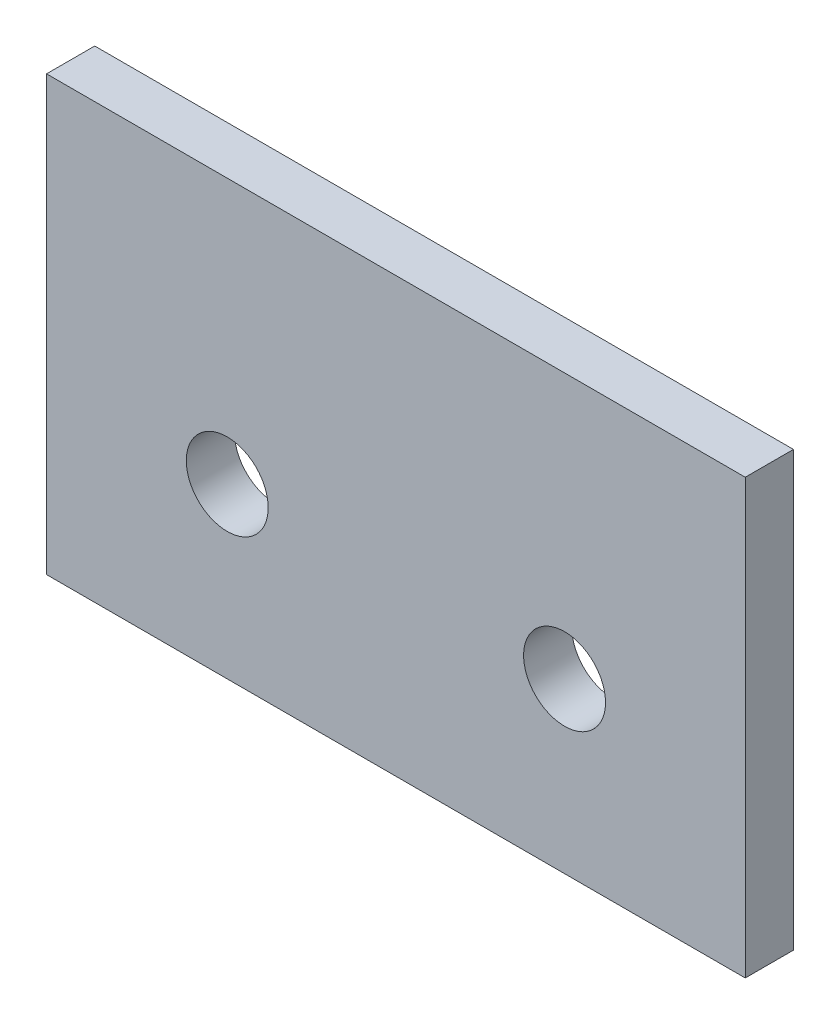
ISO-10303-21;
HEADER;
FILE_DESCRIPTION(('STEP AP214'),'2;1');
FILE_NAME('part.step','',(''),(''),'','','');
FILE_SCHEMA(('AUTOMOTIVE_DESIGN { 1 0 10303 214 1 1 1 1 }'));
ENDSEC;
DATA;
#1=APPLICATION_CONTEXT('core data for automotive mechanical design processes');
#2=APPLICATION_PROTOCOL_DEFINITION('international standard','automotive_design',2000,#1);
#3=PRODUCT_CONTEXT('',#1,'mechanical');
#4=PRODUCT('Part','Part','',(#3));
#5=PRODUCT_RELATED_PRODUCT_CATEGORY('part','',(#4));
#6=PRODUCT_DEFINITION_FORMATION('','',#4);
#7=PRODUCT_DEFINITION_CONTEXT('part definition',#1,'design');
#8=PRODUCT_DEFINITION('design','',#6,#7);
#9=PRODUCT_DEFINITION_SHAPE('','',#8);
#10=(LENGTH_UNIT() NAMED_UNIT(*) SI_UNIT(.MILLI.,.METRE.));
#11=(NAMED_UNIT(*) PLANE_ANGLE_UNIT() SI_UNIT($,.RADIAN.));
#12=(NAMED_UNIT(*) SI_UNIT($,.STERADIAN.) SOLID_ANGLE_UNIT());
#13=UNCERTAINTY_MEASURE_WITH_UNIT(LENGTH_MEASURE(1.E-05),#10,'distance_accuracy_value','');
#14=(GEOMETRIC_REPRESENTATION_CONTEXT(3) GLOBAL_UNCERTAINTY_ASSIGNED_CONTEXT((#13)) GLOBAL_UNIT_ASSIGNED_CONTEXT((#10,
#11,#12)) REPRESENTATION_CONTEXT('',''));
#15=CARTESIAN_POINT('',(0.,0.,0.));
#16=DIRECTION('',(0.,0.,1.));
#17=DIRECTION('',(1.,0.,0.));
#18=AXIS2_PLACEMENT_3D('',#15,#16,#17);
#19=CARTESIAN_POINT('',(0.,0.,2.));
#20=DIRECTION('',(0.,0.,-1.));
#21=DIRECTION('',(-1.,0.,0.));
#22=AXIS2_PLACEMENT_3D('',#19,#20,#21);
#23=PLANE('',#22);
#24=DIRECTION('',(0.,-1.,0.));
#25=VECTOR('',#24,1.);
#26=CARTESIAN_POINT('',(0.,0.,2.));
#27=LINE('',#26,#25);
#28=CARTESIAN_POINT('',(0.,18.,2.));
#29=VERTEX_POINT('',#28);
#30=CARTESIAN_POINT('',(0.,0.,2.));
#31=VERTEX_POINT('',#30);
#32=EDGE_CURVE('E96',#29,#31,#27,.T.);
#33=ORIENTED_EDGE('',*,*,#32,.T.);
#34=DIRECTION('',(1.,0.,0.));
#35=VECTOR('',#34,1.);
#36=CARTESIAN_POINT('',(0.,0.,2.));
#37=LINE('',#36,#35);
#38=CARTESIAN_POINT('',(29.,0.,2.));
#39=VERTEX_POINT('',#38);
#40=EDGE_CURVE('E91',#31,#39,#37,.T.);
#41=ORIENTED_EDGE('',*,*,#40,.T.);
#42=DIRECTION('',(0.,1.,0.));
#43=VECTOR('',#42,1.);
#44=CARTESIAN_POINT('',(29.,0.,2.));
#45=LINE('',#44,#43);
#46=CARTESIAN_POINT('',(29.,18.,2.));
#47=VERTEX_POINT('',#46);
#48=EDGE_CURVE('E94',#39,#47,#45,.T.);
#49=ORIENTED_EDGE('',*,*,#48,.T.);
#50=DIRECTION('',(-1.,0.,0.));
#51=VECTOR('',#50,1.);
#52=CARTESIAN_POINT('',(0.,18.,2.));
#53=LINE('',#52,#51);
#54=EDGE_CURVE('E61',#47,#29,#53,.T.);
#55=ORIENTED_EDGE('',*,*,#54,.T.);
#56=EDGE_LOOP('',(#33,#41,#49,#55));
#57=FACE_BOUND('',#56,.T.);
#58=CARTESIAN_POINT('',(21.5,7.,2.));
#59=DIRECTION('',(0.,0.,1.));
#60=DIRECTION('',(1.,0.,0.));
#61=AXIS2_PLACEMENT_3D('',#58,#59,#60);
#62=CIRCLE('',#61,1.7);
#63=CARTESIAN_POINT('',(23.2,7.,2.));
#64=VERTEX_POINT('',#63);
#65=EDGE_CURVE('E116',#64,#64,#62,.T.);
#66=ORIENTED_EDGE('',*,*,#65,.F.);
#67=EDGE_LOOP('',(#66));
#68=FACE_BOUND('',#67,.T.);
#69=CARTESIAN_POINT('',(7.49999999999997,7.,2.));
#70=DIRECTION('',(0.,0.,1.));
#71=DIRECTION('',(-1.,0.,0.));
#72=AXIS2_PLACEMENT_3D('',#69,#70,#71);
#73=CIRCLE('',#72,1.7);
#74=CARTESIAN_POINT('',(5.79999999999997,7.,2.));
#75=VERTEX_POINT('',#74);
#76=EDGE_CURVE('E138',#75,#75,#73,.T.);
#77=ORIENTED_EDGE('',*,*,#76,.F.);
#78=EDGE_LOOP('',(#77));
#79=FACE_BOUND('',#78,.T.);
#80=ADVANCED_FACE('F43',(#57,#68,#79),#23,.F.);
#81=CARTESIAN_POINT('',(0.,0.,0.));
#82=DIRECTION('',(0.,0.,-1.));
#83=DIRECTION('',(-1.,0.,0.));
#84=AXIS2_PLACEMENT_3D('',#81,#82,#83);
#85=PLANE('',#84);
#86=CARTESIAN_POINT('',(21.5,7.,0.));
#87=DIRECTION('',(0.,0.,1.));
#88=DIRECTION('',(1.,0.,0.));
#89=AXIS2_PLACEMENT_3D('',#86,#87,#88);
#90=CIRCLE('',#89,1.7);
#91=CARTESIAN_POINT('',(23.2,7.,0.));
#92=VERTEX_POINT('',#91);
#93=EDGE_CURVE('E134',#92,#92,#90,.T.);
#94=ORIENTED_EDGE('',*,*,#93,.T.);
#95=EDGE_LOOP('',(#94));
#96=FACE_BOUND('',#95,.T.);
#97=DIRECTION('',(0.,-1.,0.));
#98=VECTOR('',#97,1.);
#99=CARTESIAN_POINT('',(0.,0.,0.));
#100=LINE('',#99,#98);
#101=CARTESIAN_POINT('',(0.,18.,0.));
#102=VERTEX_POINT('',#101);
#103=CARTESIAN_POINT('',(0.,0.,0.));
#104=VERTEX_POINT('',#103);
#105=EDGE_CURVE('E112',#102,#104,#100,.T.);
#106=ORIENTED_EDGE('',*,*,#105,.F.);
#107=DIRECTION('',(-1.,0.,0.));
#108=VECTOR('',#107,1.);
#109=CARTESIAN_POINT('',(0.,18.,0.));
#110=LINE('',#109,#108);
#111=CARTESIAN_POINT('',(29.,18.,0.));
#112=VERTEX_POINT('',#111);
#113=EDGE_CURVE('E84',#112,#102,#110,.T.);
#114=ORIENTED_EDGE('',*,*,#113,.F.);
#115=DIRECTION('',(0.,1.,0.));
#116=VECTOR('',#115,1.);
#117=CARTESIAN_POINT('',(29.,0.,0.));
#118=LINE('',#117,#116);
#119=CARTESIAN_POINT('',(29.,0.,0.));
#120=VERTEX_POINT('',#119);
#121=EDGE_CURVE('E78',#120,#112,#118,.T.);
#122=ORIENTED_EDGE('',*,*,#121,.F.);
#123=DIRECTION('',(1.,0.,0.));
#124=VECTOR('',#123,1.);
#125=CARTESIAN_POINT('',(0.,0.,0.));
#126=LINE('',#125,#124);
#127=EDGE_CURVE('E101',#104,#120,#126,.T.);
#128=ORIENTED_EDGE('',*,*,#127,.F.);
#129=EDGE_LOOP('',(#106,#114,#122,#128));
#130=FACE_BOUND('',#129,.T.);
#131=CARTESIAN_POINT('',(7.49999999999997,7.,0.));
#132=DIRECTION('',(0.,0.,1.));
#133=DIRECTION('',(-1.,0.,0.));
#134=AXIS2_PLACEMENT_3D('',#131,#132,#133);
#135=CIRCLE('',#134,1.7);
#136=CARTESIAN_POINT('',(5.79999999999997,7.,0.));
#137=VERTEX_POINT('',#136);
#138=EDGE_CURVE('E142',#137,#137,#135,.T.);
#139=ORIENTED_EDGE('',*,*,#138,.T.);
#140=EDGE_LOOP('',(#139));
#141=FACE_BOUND('',#140,.T.);
#142=ADVANCED_FACE('F129',(#96,#130,#141),#85,.T.);
#143=CARTESIAN_POINT('',(0.,0.,2.));
#144=DIRECTION('',(1.,0.,0.));
#145=DIRECTION('',(0.,0.,-1.));
#146=AXIS2_PLACEMENT_3D('',#143,#144,#145);
#147=PLANE('',#146);
#148=ORIENTED_EDGE('',*,*,#105,.T.);
#149=DIRECTION('',(0.,0.,-1.));
#150=VECTOR('',#149,1.);
#151=CARTESIAN_POINT('',(0.,0.,2.));
#152=LINE('',#151,#150);
#153=EDGE_CURVE('E11',#31,#104,#152,.T.);
#154=ORIENTED_EDGE('',*,*,#153,.F.);
#155=ORIENTED_EDGE('',*,*,#32,.F.);
#156=DIRECTION('',(0.,0.,-1.));
#157=VECTOR('',#156,1.);
#158=CARTESIAN_POINT('',(0.,18.,2.));
#159=LINE('',#158,#157);
#160=EDGE_CURVE('E108',#29,#102,#159,.T.);
#161=ORIENTED_EDGE('',*,*,#160,.T.);
#162=EDGE_LOOP('',(#148,#154,#155,#161));
#163=FACE_BOUND('',#162,.T.);
#164=ADVANCED_FACE('F45',(#163),#147,.F.);
#165=CARTESIAN_POINT('',(0.,0.,2.));
#166=DIRECTION('',(0.,1.,0.));
#167=DIRECTION('',(0.,0.,1.));
#168=AXIS2_PLACEMENT_3D('',#165,#166,#167);
#169=PLANE('',#168);
#170=ORIENTED_EDGE('',*,*,#127,.T.);
#171=DIRECTION('',(0.,0.,-1.));
#172=VECTOR('',#171,1.);
#173=CARTESIAN_POINT('',(29.,0.,2.));
#174=LINE('',#173,#172);
#175=EDGE_CURVE('E53',#39,#120,#174,.T.);
#176=ORIENTED_EDGE('',*,*,#175,.F.);
#177=ORIENTED_EDGE('',*,*,#40,.F.);
#178=ORIENTED_EDGE('',*,*,#153,.T.);
#179=EDGE_LOOP('',(#170,#176,#177,#178));
#180=FACE_BOUND('',#179,.T.);
#181=ADVANCED_FACE('F100',(#180),#169,.F.);
#182=CARTESIAN_POINT('',(29.,0.,2.));
#183=DIRECTION('',(-1.,0.,0.));
#184=DIRECTION('',(0.,0.,1.));
#185=AXIS2_PLACEMENT_3D('',#182,#183,#184);
#186=PLANE('',#185);
#187=ORIENTED_EDGE('',*,*,#121,.T.);
#188=DIRECTION('',(0.,0.,-1.));
#189=VECTOR('',#188,1.);
#190=CARTESIAN_POINT('',(29.,18.,2.));
#191=LINE('',#190,#189);
#192=EDGE_CURVE('E103',#47,#112,#191,.T.);
#193=ORIENTED_EDGE('',*,*,#192,.F.);
#194=ORIENTED_EDGE('',*,*,#48,.F.);
#195=ORIENTED_EDGE('',*,*,#175,.T.);
#196=EDGE_LOOP('',(#187,#193,#194,#195));
#197=FACE_BOUND('',#196,.T.);
#198=ADVANCED_FACE('F104',(#197),#186,.F.);
#199=CARTESIAN_POINT('',(0.,18.,2.));
#200=DIRECTION('',(0.,-1.,0.));
#201=DIRECTION('',(1.,0.,0.));
#202=AXIS2_PLACEMENT_3D('',#199,#200,#201);
#203=PLANE('',#202);
#204=ORIENTED_EDGE('',*,*,#113,.T.);
#205=ORIENTED_EDGE('',*,*,#160,.F.);
#206=ORIENTED_EDGE('',*,*,#54,.F.);
#207=ORIENTED_EDGE('',*,*,#192,.T.);
#208=EDGE_LOOP('',(#204,#205,#206,#207));
#209=FACE_BOUND('',#208,.T.);
#210=ADVANCED_FACE('F126',(#209),#203,.F.);
#211=CARTESIAN_POINT('',(21.5,7.,2.));
#212=DIRECTION('',(0.,0.,-1.));
#213=DIRECTION('',(-1.,0.,0.));
#214=AXIS2_PLACEMENT_3D('',#211,#212,#213);
#215=CYLINDRICAL_SURFACE('',#214,1.7);
#216=ORIENTED_EDGE('',*,*,#65,.T.);
#217=EDGE_LOOP('',(#216));
#218=FACE_BOUND('',#217,.T.);
#219=ORIENTED_EDGE('',*,*,#93,.F.);
#220=EDGE_LOOP('',(#219));
#221=FACE_BOUND('',#220,.T.);
#222=ADVANCED_FACE('F161',(#218,#221),#215,.F.);
#223=CARTESIAN_POINT('',(7.49999999999997,7.,2.));
#224=DIRECTION('',(0.,0.,-1.));
#225=DIRECTION('',(-1.,0.,0.));
#226=AXIS2_PLACEMENT_3D('',#223,#224,#225);
#227=CYLINDRICAL_SURFACE('',#226,1.7);
#228=ORIENTED_EDGE('',*,*,#76,.T.);
#229=EDGE_LOOP('',(#228));
#230=FACE_BOUND('',#229,.T.);
#231=ORIENTED_EDGE('',*,*,#138,.F.);
#232=EDGE_LOOP('',(#231));
#233=FACE_BOUND('',#232,.T.);
#234=ADVANCED_FACE('F150',(#230,#233),#227,.F.);
#235=CLOSED_SHELL('',(#80,#142,#164,#181,#198,#210,#222,#234));
#236=MANIFOLD_SOLID_BREP('B2',#235);
#237=ADVANCED_BREP_SHAPE_REPRESENTATION('',(#18,#236),#14);
#238=SHAPE_DEFINITION_REPRESENTATION(#9,#237);
ENDSEC;
END-ISO-10303-21;
